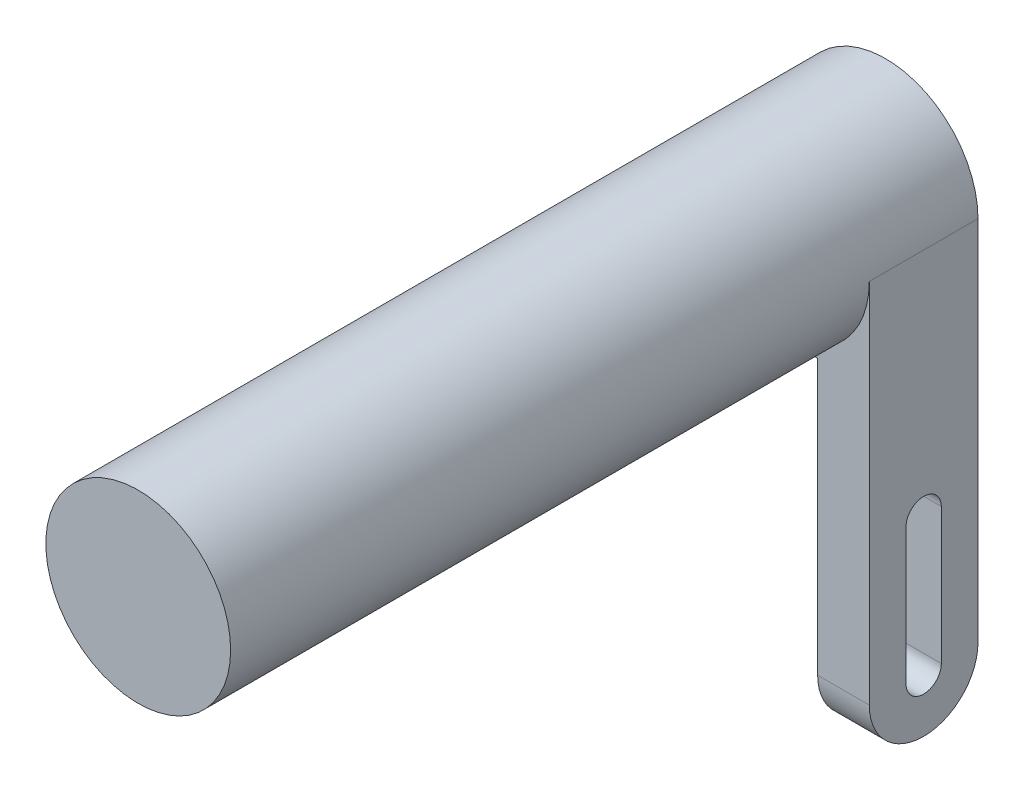
ISO-10303-21;
HEADER;
FILE_DESCRIPTION(('STEP AP214'),'2;1');
FILE_NAME('part.step','',(''),(''),'','','');
FILE_SCHEMA(('AUTOMOTIVE_DESIGN { 1 0 10303 214 1 1 1 1 }'));
ENDSEC;
DATA;
#1=APPLICATION_CONTEXT('core data for automotive mechanical design processes');
#2=APPLICATION_PROTOCOL_DEFINITION('international standard','automotive_design',2000,#1);
#3=PRODUCT_CONTEXT('',#1,'mechanical');
#4=PRODUCT('Part','Part','',(#3));
#5=PRODUCT_RELATED_PRODUCT_CATEGORY('part','',(#4));
#6=PRODUCT_DEFINITION_FORMATION('','',#4);
#7=PRODUCT_DEFINITION_CONTEXT('part definition',#1,'design');
#8=PRODUCT_DEFINITION('design','',#6,#7);
#9=PRODUCT_DEFINITION_SHAPE('','',#8);
#10=(LENGTH_UNIT() NAMED_UNIT(*) SI_UNIT(.MILLI.,.METRE.));
#11=(NAMED_UNIT(*) PLANE_ANGLE_UNIT() SI_UNIT($,.RADIAN.));
#12=(NAMED_UNIT(*) SI_UNIT($,.STERADIAN.) SOLID_ANGLE_UNIT());
#13=UNCERTAINTY_MEASURE_WITH_UNIT(LENGTH_MEASURE(1.E-05),#10,'distance_accuracy_value','');
#14=(GEOMETRIC_REPRESENTATION_CONTEXT(3) GLOBAL_UNCERTAINTY_ASSIGNED_CONTEXT((#13)) GLOBAL_UNIT_ASSIGNED_CONTEXT((#10,
#11,#12)) REPRESENTATION_CONTEXT('',''));
#15=CARTESIAN_POINT('',(0.,0.,0.));
#16=DIRECTION('',(0.,0.,1.));
#17=DIRECTION('',(1.,0.,0.));
#18=AXIS2_PLACEMENT_3D('',#15,#16,#17);
#19=CARTESIAN_POINT('',(3.4,-3.4,8.80832611206852));
#20=DIRECTION('',(0.,-1.,0.));
#21=DIRECTION('',(0.,0.,-1.));
#22=AXIS2_PLACEMENT_3D('',#19,#20,#21);
#23=PLANE('',#22);
#24=DIRECTION('',(-1.,0.,0.));
#25=VECTOR('',#24,1.);
#26=CARTESIAN_POINT('',(3.4,-3.4,0.));
#27=LINE('',#26,#25);
#28=CARTESIAN_POINT('',(1.5,-3.4,0.));
#29=VERTEX_POINT('',#28);
#30=CARTESIAN_POINT('',(0.,-3.4,0.));
#31=VERTEX_POINT('',#30);
#32=EDGE_CURVE('E77',#29,#31,#27,.T.);
#33=ORIENTED_EDGE('',*,*,#32,.F.);
#34=DIRECTION('',(0.,0.,-1.));
#35=VECTOR('',#34,1.);
#36=CARTESIAN_POINT('',(1.5,-3.4,0.));
#37=LINE('',#36,#35);
#38=CARTESIAN_POINT('',(1.5,-3.4,4.));
#39=VERTEX_POINT('',#38);
#40=EDGE_CURVE('E157',#39,#29,#37,.T.);
#41=ORIENTED_EDGE('',*,*,#40,.F.);
#42=DIRECTION('',(1.,0.,0.));
#43=VECTOR('',#42,1.);
#44=CARTESIAN_POINT('',(3.4,-3.4,4.));
#45=LINE('',#44,#43);
#46=CARTESIAN_POINT('',(0.,-3.4,4.));
#47=VERTEX_POINT('',#46);
#48=EDGE_CURVE('E171',#47,#39,#45,.T.);
#49=ORIENTED_EDGE('',*,*,#48,.F.);
#50=DIRECTION('',(0.,0.,-1.));
#51=VECTOR('',#50,1.);
#52=CARTESIAN_POINT('',(0.,-3.4,8.80832611206852));
#53=LINE('',#52,#51);
#54=EDGE_CURVE('E174',#47,#31,#53,.T.);
#55=ORIENTED_EDGE('',*,*,#54,.T.);
#56=EDGE_LOOP('',(#33,#41,#49,#55));
#57=FACE_BOUND('',#56,.T.);
#58=ADVANCED_FACE('F51',(#57),#23,.T.);
#59=CARTESIAN_POINT('',(0.,0.,0.));
#60=DIRECTION('',(0.,0.,1.));
#61=DIRECTION('',(1.,0.,0.));
#62=AXIS2_PLACEMENT_3D('',#59,#60,#61);
#63=PLANE('',#62);
#64=CARTESIAN_POINT('',(0.,0.,0.));
#65=DIRECTION('',(0.,0.,1.));
#66=DIRECTION('',(1.,0.,0.));
#67=AXIS2_PLACEMENT_3D('',#64,#65,#66);
#68=CIRCLE('',#67,3.4);
#69=CARTESIAN_POINT('',(3.4,0.,0.));
#70=VERTEX_POINT('',#69);
#71=EDGE_CURVE('E11',#70,#31,#68,.T.);
#72=ORIENTED_EDGE('',*,*,#71,.F.);
#73=DIRECTION('',(0.,-1.,0.));
#74=VECTOR('',#73,1.);
#75=CARTESIAN_POINT('',(3.4,-3.4,0.));
#76=LINE('',#75,#74);
#77=CARTESIAN_POINT('',(3.4,-13.5,0.));
#78=VERTEX_POINT('',#77);
#79=EDGE_CURVE('E125',#70,#78,#76,.T.);
#80=ORIENTED_EDGE('',*,*,#79,.T.);
#81=DIRECTION('',(-1.,0.,0.));
#82=VECTOR('',#81,1.);
#83=CARTESIAN_POINT('',(16.1440182046323,-13.5,0.));
#84=LINE('',#83,#82);
#85=CARTESIAN_POINT('',(1.5,-13.5,0.));
#86=VERTEX_POINT('',#85);
#87=EDGE_CURVE('E130',#78,#86,#84,.T.);
#88=ORIENTED_EDGE('',*,*,#87,.T.);
#89=DIRECTION('',(0.,-1.,0.));
#90=VECTOR('',#89,1.);
#91=CARTESIAN_POINT('',(1.5,0.,0.));
#92=LINE('',#91,#90);
#93=EDGE_CURVE('E351',#29,#86,#92,.T.);
#94=ORIENTED_EDGE('',*,*,#93,.F.);
#95=ORIENTED_EDGE('',*,*,#32,.T.);
#96=EDGE_LOOP('',(#72,#80,#88,#94,#95));
#97=FACE_BOUND('',#96,.T.);
#98=CARTESIAN_POINT('',(0.,0.,0.));
#99=DIRECTION('',(0.,0.,1.));
#100=DIRECTION('',(1.,0.,0.));
#101=AXIS2_PLACEMENT_3D('',#98,#99,#100);
#102=CIRCLE('',#101,2.6);
#103=CARTESIAN_POINT('',(2.6,0.,0.));
#104=VERTEX_POINT('',#103);
#105=EDGE_CURVE('E60',#104,#104,#102,.T.);
#106=ORIENTED_EDGE('',*,*,#105,.T.);
#107=EDGE_LOOP('',(#106));
#108=FACE_BOUND('',#107,.T.);
#109=ADVANCED_FACE('F127',(#97,#108),#63,.F.);
#110=CARTESIAN_POINT('',(0.,0.,27.));
#111=DIRECTION('',(0.,0.,-1.));
#112=DIRECTION('',(-1.,0.,0.));
#113=AXIS2_PLACEMENT_3D('',#110,#111,#112);
#114=CYLINDRICAL_SURFACE('',#113,3.4);
#115=CARTESIAN_POINT('',(0.,0.,4.));
#116=DIRECTION('',(0.,0.,-1.));
#117=DIRECTION('',(0.,1.,0.));
#118=AXIS2_PLACEMENT_3D('',#115,#116,#117);
#119=CIRCLE('',#118,3.4);
#120=CARTESIAN_POINT('',(3.4,0.,4.));
#121=VERTEX_POINT('',#120);
#122=EDGE_CURVE('E69',#121,#47,#119,.T.);
#123=ORIENTED_EDGE('',*,*,#122,.F.);
#124=DIRECTION('',(0.,0.,-1.));
#125=VECTOR('',#124,1.);
#126=CARTESIAN_POINT('',(3.4,0.,8.80832611206852));
#127=LINE('',#126,#125);
#128=EDGE_CURVE('E169',#121,#70,#127,.T.);
#129=ORIENTED_EDGE('',*,*,#128,.T.);
#130=ORIENTED_EDGE('',*,*,#71,.T.);
#131=ORIENTED_EDGE('',*,*,#54,.F.);
#132=EDGE_LOOP('',(#123,#129,#130,#131));
#133=FACE_BOUND('',#132,.T.);
#134=CARTESIAN_POINT('',(0.,0.,27.5));
#135=DIRECTION('',(0.,0.,1.));
#136=DIRECTION('',(1.,0.,0.));
#137=AXIS2_PLACEMENT_3D('',#134,#135,#136);
#138=CIRCLE('',#137,3.4);
#139=CARTESIAN_POINT('',(3.4,0.,27.5));
#140=VERTEX_POINT('',#139);
#141=EDGE_CURVE('E181',#140,#140,#138,.T.);
#142=ORIENTED_EDGE('',*,*,#141,.F.);
#143=EDGE_LOOP('',(#142));
#144=FACE_BOUND('',#143,.T.);
#145=ADVANCED_FACE('F53',(#133,#144),#114,.T.);
#146=CARTESIAN_POINT('',(0.,0.,27.));
#147=DIRECTION('',(0.,0.,-1.));
#148=DIRECTION('',(-1.,0.,0.));
#149=AXIS2_PLACEMENT_3D('',#146,#147,#148);
#150=CYLINDRICAL_SURFACE('',#149,2.6);
#151=CARTESIAN_POINT('',(0.,0.,27.));
#152=DIRECTION('',(0.,0.,1.));
#153=DIRECTION('',(1.,0.,0.));
#154=AXIS2_PLACEMENT_3D('',#151,#152,#153);
#155=CIRCLE('',#154,2.6);
#156=CARTESIAN_POINT('',(2.6,0.,27.));
#157=VERTEX_POINT('',#156);
#158=EDGE_CURVE('E185',#157,#157,#155,.T.);
#159=ORIENTED_EDGE('',*,*,#158,.T.);
#160=EDGE_LOOP('',(#159));
#161=FACE_BOUND('',#160,.T.);
#162=ORIENTED_EDGE('',*,*,#105,.F.);
#163=EDGE_LOOP('',(#162));
#164=FACE_BOUND('',#163,.T.);
#165=ADVANCED_FACE('F192',(#161,#164),#150,.F.);
#166=CARTESIAN_POINT('',(0.,0.,27.));
#167=DIRECTION('',(0.,0.,1.));
#168=DIRECTION('',(1.,0.,0.));
#169=AXIS2_PLACEMENT_3D('',#166,#167,#168);
#170=PLANE('',#169);
#171=ORIENTED_EDGE('',*,*,#158,.F.);
#172=EDGE_LOOP('',(#171));
#173=FACE_BOUND('',#172,.T.);
#174=ADVANCED_FACE('F194',(#173),#170,.F.);
#175=CARTESIAN_POINT('',(0.,0.,27.5));
#176=DIRECTION('',(0.,0.,1.));
#177=DIRECTION('',(1.,0.,0.));
#178=AXIS2_PLACEMENT_3D('',#175,#176,#177);
#179=PLANE('',#178);
#180=ORIENTED_EDGE('',*,*,#141,.T.);
#181=EDGE_LOOP('',(#180));
#182=FACE_BOUND('',#181,.T.);
#183=ADVANCED_FACE('F200',(#182),#179,.T.);
#184=CARTESIAN_POINT('',(3.4,-3.4,8.80832611206852));
#185=DIRECTION('',(1.,0.,0.));
#186=DIRECTION('',(0.,0.,-1.));
#187=AXIS2_PLACEMENT_3D('',#184,#185,#186);
#188=PLANE('',#187);
#189=DIRECTION('',(0.,1.,0.));
#190=VECTOR('',#189,1.);
#191=CARTESIAN_POINT('',(3.4,-3.4,4.));
#192=LINE('',#191,#190);
#193=CARTESIAN_POINT('',(3.4,-13.5,4.));
#194=VERTEX_POINT('',#193);
#195=EDGE_CURVE('E140',#194,#121,#192,.T.);
#196=ORIENTED_EDGE('',*,*,#195,.F.);
#197=CARTESIAN_POINT('',(3.4,-13.5,2.));
#198=DIRECTION('',(1.,0.,0.));
#199=DIRECTION('',(0.,0.,-1.));
#200=AXIS2_PLACEMENT_3D('',#197,#198,#199);
#201=CIRCLE('',#200,2.);
#202=EDGE_CURVE('E137',#194,#78,#201,.T.);
#203=ORIENTED_EDGE('',*,*,#202,.T.);
#204=ORIENTED_EDGE('',*,*,#79,.F.);
#205=ORIENTED_EDGE('',*,*,#128,.F.);
#206=EDGE_LOOP('',(#196,#203,#204,#205));
#207=FACE_BOUND('',#206,.T.);
#208=CARTESIAN_POINT('',(3.4,-8.5,2.));
#209=DIRECTION('',(1.,0.,0.));
#210=DIRECTION('',(0.,0.,-1.));
#211=AXIS2_PLACEMENT_3D('',#208,#209,#210);
#212=CIRCLE('',#211,0.649999999999998);
#213=CARTESIAN_POINT('',(3.4,-8.5,1.35));
#214=VERTEX_POINT('',#213);
#215=CARTESIAN_POINT('',(3.4,-8.5,2.65));
#216=VERTEX_POINT('',#215);
#217=EDGE_CURVE('E362',#214,#216,#212,.T.);
#218=ORIENTED_EDGE('',*,*,#217,.F.);
#219=DIRECTION('',(0.,1.,0.));
#220=VECTOR('',#219,1.);
#221=CARTESIAN_POINT('',(3.4,0.,1.35));
#222=LINE('',#221,#220);
#223=CARTESIAN_POINT('',(3.4,-13.5,1.35));
#224=VERTEX_POINT('',#223);
#225=EDGE_CURVE('E366',#224,#214,#222,.T.);
#226=ORIENTED_EDGE('',*,*,#225,.F.);
#227=CARTESIAN_POINT('',(3.4,-13.5,2.));
#228=DIRECTION('',(1.,0.,0.));
#229=DIRECTION('',(0.,0.,-1.));
#230=AXIS2_PLACEMENT_3D('',#227,#228,#229);
#231=CIRCLE('',#230,0.649999999999998);
#232=CARTESIAN_POINT('',(3.4,-13.5,2.65));
#233=VERTEX_POINT('',#232);
#234=EDGE_CURVE('E368',#233,#224,#231,.T.);
#235=ORIENTED_EDGE('',*,*,#234,.F.);
#236=DIRECTION('',(0.,1.,0.));
#237=VECTOR('',#236,1.);
#238=CARTESIAN_POINT('',(3.4,0.,2.65));
#239=LINE('',#238,#237);
#240=EDGE_CURVE('E144',#233,#216,#239,.T.);
#241=ORIENTED_EDGE('',*,*,#240,.T.);
#242=EDGE_LOOP('',(#218,#226,#235,#241));
#243=FACE_BOUND('',#242,.T.);
#244=ADVANCED_FACE('F138',(#207,#243),#188,.T.);
#245=CARTESIAN_POINT('',(16.1440182046323,0.,4.));
#246=DIRECTION('',(0.,0.,-1.));
#247=DIRECTION('',(0.,1.,0.));
#248=AXIS2_PLACEMENT_3D('',#245,#246,#247);
#249=PLANE('',#248);
#250=ORIENTED_EDGE('',*,*,#195,.T.);
#251=ORIENTED_EDGE('',*,*,#122,.T.);
#252=ORIENTED_EDGE('',*,*,#48,.T.);
#253=DIRECTION('',(0.,-1.,0.));
#254=VECTOR('',#253,1.);
#255=CARTESIAN_POINT('',(1.5,0.,4.));
#256=LINE('',#255,#254);
#257=CARTESIAN_POINT('',(1.5,-13.5,4.));
#258=VERTEX_POINT('',#257);
#259=EDGE_CURVE('E346',#39,#258,#256,.T.);
#260=ORIENTED_EDGE('',*,*,#259,.T.);
#261=DIRECTION('',(-1.,0.,0.));
#262=VECTOR('',#261,1.);
#263=CARTESIAN_POINT('',(16.1440182046323,-13.5,4.));
#264=LINE('',#263,#262);
#265=EDGE_CURVE('E134',#194,#258,#264,.T.);
#266=ORIENTED_EDGE('',*,*,#265,.F.);
#267=EDGE_LOOP('',(#250,#251,#252,#260,#266));
#268=FACE_BOUND('',#267,.T.);
#269=ADVANCED_FACE('F212',(#268),#249,.F.);
#270=CARTESIAN_POINT('',(16.1440182046323,0.,2.65));
#271=DIRECTION('',(0.,0.,1.));
#272=DIRECTION('',(0.,-1.,0.));
#273=AXIS2_PLACEMENT_3D('',#270,#271,#272);
#274=PLANE('',#273);
#275=ORIENTED_EDGE('',*,*,#240,.F.);
#276=DIRECTION('',(-1.,0.,0.));
#277=VECTOR('',#276,1.);
#278=CARTESIAN_POINT('',(16.1440182046323,-13.5,2.65));
#279=LINE('',#278,#277);
#280=CARTESIAN_POINT('',(1.5,-13.5,2.65));
#281=VERTEX_POINT('',#280);
#282=EDGE_CURVE('E163',#233,#281,#279,.T.);
#283=ORIENTED_EDGE('',*,*,#282,.T.);
#284=DIRECTION('',(0.,1.,0.));
#285=VECTOR('',#284,1.);
#286=CARTESIAN_POINT('',(1.5,0.,2.65));
#287=LINE('',#286,#285);
#288=CARTESIAN_POINT('',(1.5,-8.5,2.65));
#289=VERTEX_POINT('',#288);
#290=EDGE_CURVE('E348',#281,#289,#287,.T.);
#291=ORIENTED_EDGE('',*,*,#290,.T.);
#292=DIRECTION('',(-1.,0.,0.));
#293=VECTOR('',#292,1.);
#294=CARTESIAN_POINT('',(16.1440182046323,-8.5,2.65));
#295=LINE('',#294,#293);
#296=EDGE_CURVE('E160',#216,#289,#295,.T.);
#297=ORIENTED_EDGE('',*,*,#296,.F.);
#298=EDGE_LOOP('',(#275,#283,#291,#297));
#299=FACE_BOUND('',#298,.T.);
#300=ADVANCED_FACE('F257',(#299),#274,.F.);
#301=CARTESIAN_POINT('',(16.1440182046323,-13.5,2.));
#302=DIRECTION('',(-1.,0.,0.));
#303=DIRECTION('',(0.,0.,1.));
#304=AXIS2_PLACEMENT_3D('',#301,#302,#303);
#305=CYLINDRICAL_SURFACE('',#304,0.649999999999998);
#306=ORIENTED_EDGE('',*,*,#282,.F.);
#307=ORIENTED_EDGE('',*,*,#234,.T.);
#308=DIRECTION('',(-1.,0.,0.));
#309=VECTOR('',#308,1.);
#310=CARTESIAN_POINT('',(16.1440182046323,-13.5,1.35));
#311=LINE('',#310,#309);
#312=CARTESIAN_POINT('',(1.5,-13.5,1.35));
#313=VERTEX_POINT('',#312);
#314=EDGE_CURVE('E154',#224,#313,#311,.T.);
#315=ORIENTED_EDGE('',*,*,#314,.T.);
#316=CARTESIAN_POINT('',(1.5,-13.5,2.));
#317=DIRECTION('',(1.,0.,0.));
#318=DIRECTION('',(0.,0.,-1.));
#319=AXIS2_PLACEMENT_3D('',#316,#317,#318);
#320=CIRCLE('',#319,0.649999999999998);
#321=EDGE_CURVE('E356',#281,#313,#320,.T.);
#322=ORIENTED_EDGE('',*,*,#321,.F.);
#323=EDGE_LOOP('',(#306,#307,#315,#322));
#324=FACE_BOUND('',#323,.T.);
#325=ADVANCED_FACE('F265',(#324),#305,.F.);
#326=CARTESIAN_POINT('',(16.1440182046323,0.,1.35));
#327=DIRECTION('',(0.,0.,1.));
#328=DIRECTION('',(0.,-1.,0.));
#329=AXIS2_PLACEMENT_3D('',#326,#327,#328);
#330=PLANE('',#329);
#331=ORIENTED_EDGE('',*,*,#314,.F.);
#332=ORIENTED_EDGE('',*,*,#225,.T.);
#333=DIRECTION('',(-1.,0.,0.));
#334=VECTOR('',#333,1.);
#335=CARTESIAN_POINT('',(16.1440182046323,-8.5,1.35));
#336=LINE('',#335,#334);
#337=CARTESIAN_POINT('',(1.5,-8.5,1.35));
#338=VERTEX_POINT('',#337);
#339=EDGE_CURVE('E150',#214,#338,#336,.T.);
#340=ORIENTED_EDGE('',*,*,#339,.T.);
#341=DIRECTION('',(0.,1.,0.));
#342=VECTOR('',#341,1.);
#343=CARTESIAN_POINT('',(1.5,0.,1.35));
#344=LINE('',#343,#342);
#345=EDGE_CURVE('E359',#313,#338,#344,.T.);
#346=ORIENTED_EDGE('',*,*,#345,.F.);
#347=EDGE_LOOP('',(#331,#332,#340,#346));
#348=FACE_BOUND('',#347,.T.);
#349=ADVANCED_FACE('F272',(#348),#330,.T.);
#350=CARTESIAN_POINT('',(16.1440182046323,-8.5,2.));
#351=DIRECTION('',(-1.,0.,0.));
#352=DIRECTION('',(0.,0.,1.));
#353=AXIS2_PLACEMENT_3D('',#350,#351,#352);
#354=CYLINDRICAL_SURFACE('',#353,0.649999999999998);
#355=ORIENTED_EDGE('',*,*,#339,.F.);
#356=ORIENTED_EDGE('',*,*,#217,.T.);
#357=ORIENTED_EDGE('',*,*,#296,.T.);
#358=CARTESIAN_POINT('',(1.5,-8.5,2.));
#359=DIRECTION('',(1.,0.,0.));
#360=DIRECTION('',(0.,0.,-1.));
#361=AXIS2_PLACEMENT_3D('',#358,#359,#360);
#362=CIRCLE('',#361,0.649999999999998);
#363=EDGE_CURVE('E343',#338,#289,#362,.T.);
#364=ORIENTED_EDGE('',*,*,#363,.F.);
#365=EDGE_LOOP('',(#355,#356,#357,#364));
#366=FACE_BOUND('',#365,.T.);
#367=ADVANCED_FACE('F280',(#366),#354,.F.);
#368=CARTESIAN_POINT('',(1.5,0.,0.));
#369=DIRECTION('',(1.,0.,0.));
#370=DIRECTION('',(0.,0.,-1.));
#371=AXIS2_PLACEMENT_3D('',#368,#369,#370);
#372=PLANE('',#371);
#373=ORIENTED_EDGE('',*,*,#363,.T.);
#374=ORIENTED_EDGE('',*,*,#290,.F.);
#375=ORIENTED_EDGE('',*,*,#321,.T.);
#376=ORIENTED_EDGE('',*,*,#345,.T.);
#377=EDGE_LOOP('',(#373,#374,#375,#376));
#378=FACE_BOUND('',#377,.T.);
#379=ORIENTED_EDGE('',*,*,#259,.F.);
#380=ORIENTED_EDGE('',*,*,#40,.T.);
#381=ORIENTED_EDGE('',*,*,#93,.T.);
#382=CARTESIAN_POINT('',(1.5,-13.5,2.));
#383=DIRECTION('',(1.,0.,0.));
#384=DIRECTION('',(0.,0.,-1.));
#385=AXIS2_PLACEMENT_3D('',#382,#383,#384);
#386=CIRCLE('',#385,2.);
#387=EDGE_CURVE('E148',#258,#86,#386,.T.);
#388=ORIENTED_EDGE('',*,*,#387,.F.);
#389=EDGE_LOOP('',(#379,#380,#381,#388));
#390=FACE_BOUND('',#389,.T.);
#391=ADVANCED_FACE('F288',(#378,#390),#372,.F.);
#392=CARTESIAN_POINT('',(16.1440182046323,-13.5,2.));
#393=DIRECTION('',(-1.,0.,0.));
#394=DIRECTION('',(0.,0.,1.));
#395=AXIS2_PLACEMENT_3D('',#392,#393,#394);
#396=CYLINDRICAL_SURFACE('',#395,2.);
#397=ORIENTED_EDGE('',*,*,#202,.F.);
#398=ORIENTED_EDGE('',*,*,#265,.T.);
#399=ORIENTED_EDGE('',*,*,#387,.T.);
#400=ORIENTED_EDGE('',*,*,#87,.F.);
#401=EDGE_LOOP('',(#397,#398,#399,#400));
#402=FACE_BOUND('',#401,.T.);
#403=ADVANCED_FACE('F146',(#402),#396,.T.);
#404=CLOSED_SHELL('',(#58,#109,#145,#165,#174,#183,#244,#269,#300,#325,#349,#367,#391,#403));
#405=MANIFOLD_SOLID_BREP('B2',#404);
#406=ADVANCED_BREP_SHAPE_REPRESENTATION('',(#18,#405),#14);
#407=SHAPE_DEFINITION_REPRESENTATION(#9,#406);
ENDSEC;
END-ISO-10303-21;
